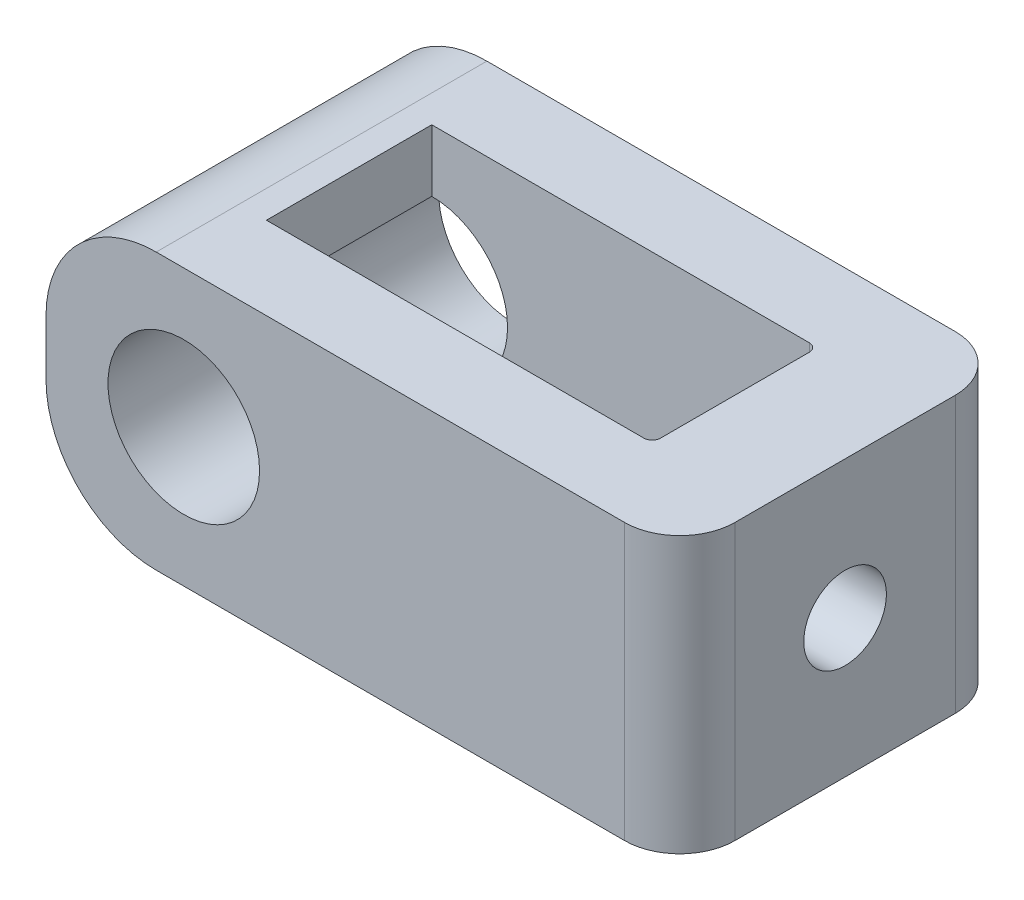
ISO-10303-21;
HEADER;
FILE_DESCRIPTION(('STEP AP214'),'2;1');
FILE_NAME('part.step','',(''),(''),'','','');
FILE_SCHEMA(('AUTOMOTIVE_DESIGN { 1 0 10303 214 1 1 1 1 }'));
ENDSEC;
DATA;
#1=APPLICATION_CONTEXT('core data for automotive mechanical design processes');
#2=APPLICATION_PROTOCOL_DEFINITION('international standard','automotive_design',2000,#1);
#3=PRODUCT_CONTEXT('',#1,'mechanical');
#4=PRODUCT('Part','Part','',(#3));
#5=PRODUCT_RELATED_PRODUCT_CATEGORY('part','',(#4));
#6=PRODUCT_DEFINITION_FORMATION('','',#4);
#7=PRODUCT_DEFINITION_CONTEXT('part definition',#1,'design');
#8=PRODUCT_DEFINITION('design','',#6,#7);
#9=PRODUCT_DEFINITION_SHAPE('','',#8);
#10=(LENGTH_UNIT() NAMED_UNIT(*) SI_UNIT(.MILLI.,.METRE.));
#11=(NAMED_UNIT(*) PLANE_ANGLE_UNIT() SI_UNIT($,.RADIAN.));
#12=(NAMED_UNIT(*) SI_UNIT($,.STERADIAN.) SOLID_ANGLE_UNIT());
#13=UNCERTAINTY_MEASURE_WITH_UNIT(LENGTH_MEASURE(1.E-05),#10,'distance_accuracy_value','');
#14=(GEOMETRIC_REPRESENTATION_CONTEXT(3) GLOBAL_UNCERTAINTY_ASSIGNED_CONTEXT((#13)) GLOBAL_UNIT_ASSIGNED_CONTEXT((#10,
#11,#12)) REPRESENTATION_CONTEXT('',''));
#15=CARTESIAN_POINT('',(0.,0.,0.));
#16=DIRECTION('',(0.,0.,1.));
#17=DIRECTION('',(1.,0.,0.));
#18=AXIS2_PLACEMENT_3D('',#15,#16,#17);
#19=CARTESIAN_POINT('',(0.,10.,-3.));
#20=DIRECTION('',(1.,0.,0.));
#21=DIRECTION('',(0.,0.,-1.));
#22=AXIS2_PLACEMENT_3D('',#19,#20,#21);
#23=PLANE('',#22);
#24=CARTESIAN_POINT('',(0.,5.,0.));
#25=DIRECTION('',(1.,0.,0.));
#26=DIRECTION('',(0.,0.,-1.));
#27=AXIS2_PLACEMENT_3D('',#24,#25,#26);
#28=CIRCLE('',#27,1.5);
#29=CARTESIAN_POINT('',(0.,5.,-1.5));
#30=VERTEX_POINT('',#29);
#31=EDGE_CURVE('E358',#30,#30,#28,.T.);
#32=ORIENTED_EDGE('',*,*,#31,.T.);
#33=EDGE_LOOP('',(#32));
#34=FACE_BOUND('',#33,.T.);
#35=DIRECTION('',(0.,0.,1.));
#36=VECTOR('',#35,1.);
#37=CARTESIAN_POINT('',(0.,0.,-3.));
#38=LINE('',#37,#36);
#39=CARTESIAN_POINT('',(0.,0.,-2.7));
#40=VERTEX_POINT('',#39);
#41=CARTESIAN_POINT('',(0.,0.,2.7));
#42=VERTEX_POINT('',#41);
#43=EDGE_CURVE('E233',#40,#42,#38,.T.);
#44=ORIENTED_EDGE('',*,*,#43,.T.);
#45=DIRECTION('',(0.,-1.,0.));
#46=VECTOR('',#45,1.);
#47=CARTESIAN_POINT('',(0.,10.,2.7));
#48=LINE('',#47,#46);
#49=CARTESIAN_POINT('',(0.,10.,2.7));
#50=VERTEX_POINT('',#49);
#51=EDGE_CURVE('E215',#42,#50,#48,.F.);
#52=ORIENTED_EDGE('',*,*,#51,.T.);
#53=DIRECTION('',(0.,0.,1.));
#54=VECTOR('',#53,1.);
#55=CARTESIAN_POINT('',(0.,10.,-3.));
#56=LINE('',#55,#54);
#57=CARTESIAN_POINT('',(0.,10.,-2.7));
#58=VERTEX_POINT('',#57);
#59=EDGE_CURVE('E240',#58,#50,#56,.T.);
#60=ORIENTED_EDGE('',*,*,#59,.F.);
#61=DIRECTION('',(0.,-1.,0.));
#62=VECTOR('',#61,1.);
#63=CARTESIAN_POINT('',(0.,0.,-2.7));
#64=LINE('',#63,#62);
#65=EDGE_CURVE('E212',#58,#40,#64,.T.);
#66=ORIENTED_EDGE('',*,*,#65,.T.);
#67=EDGE_LOOP('',(#44,#52,#60,#66));
#68=FACE_BOUND('',#67,.T.);
#69=ADVANCED_FACE('F42',(#34,#68),#23,.F.);
#70=CARTESIAN_POINT('',(0.,10.,3.));
#71=DIRECTION('',(0.,0.,1.));
#72=DIRECTION('',(1.,0.,0.));
#73=AXIS2_PLACEMENT_3D('',#70,#71,#72);
#74=PLANE('',#73);
#75=DIRECTION('',(-1.,0.,0.));
#76=VECTOR('',#75,1.);
#77=CARTESIAN_POINT('',(0.,0.,3.));
#78=LINE('',#77,#76);
#79=CARTESIAN_POINT('',(-0.299999999999999,0.,3.));
#80=VERTEX_POINT('',#79);
#81=CARTESIAN_POINT('',(-14.,0.,3.));
#82=VERTEX_POINT('',#81);
#83=EDGE_CURVE('E280',#80,#82,#78,.T.);
#84=ORIENTED_EDGE('',*,*,#83,.T.);
#85=DIRECTION('',(0.,-1.,0.));
#86=VECTOR('',#85,1.);
#87=CARTESIAN_POINT('',(-14.,0.,3.));
#88=LINE('',#87,#86);
#89=CARTESIAN_POINT('',(-14.,2.25,3.));
#90=VERTEX_POINT('',#89);
#91=EDGE_CURVE('E395',#90,#82,#88,.T.);
#92=ORIENTED_EDGE('',*,*,#91,.F.);
#93=CARTESIAN_POINT('',(-14.,5.,3.));
#94=DIRECTION('',(0.,0.,1.));
#95=DIRECTION('',(1.,0.,0.));
#96=AXIS2_PLACEMENT_3D('',#93,#94,#95);
#97=CIRCLE('',#96,2.75);
#98=CARTESIAN_POINT('',(-14.,7.75,3.));
#99=VERTEX_POINT('',#98);
#100=EDGE_CURVE('E281',#90,#99,#97,.T.);
#101=ORIENTED_EDGE('',*,*,#100,.T.);
#102=DIRECTION('',(0.,-1.,0.));
#103=VECTOR('',#102,1.);
#104=CARTESIAN_POINT('',(-14.,0.,3.));
#105=LINE('',#104,#103);
#106=CARTESIAN_POINT('',(-14.,10.,3.));
#107=VERTEX_POINT('',#106);
#108=EDGE_CURVE('E57',#107,#99,#105,.T.);
#109=ORIENTED_EDGE('',*,*,#108,.F.);
#110=DIRECTION('',(-1.,0.,0.));
#111=VECTOR('',#110,1.);
#112=CARTESIAN_POINT('',(0.,10.,3.));
#113=LINE('',#112,#111);
#114=CARTESIAN_POINT('',(-0.299999999999999,10.,3.));
#115=VERTEX_POINT('',#114);
#116=EDGE_CURVE('E244',#115,#107,#113,.T.);
#117=ORIENTED_EDGE('',*,*,#116,.F.);
#118=DIRECTION('',(0.,-1.,0.));
#119=VECTOR('',#118,1.);
#120=CARTESIAN_POINT('',(-0.299999999999999,0.,3.));
#121=LINE('',#120,#119);
#122=EDGE_CURVE('E209',#115,#80,#121,.T.);
#123=ORIENTED_EDGE('',*,*,#122,.T.);
#124=EDGE_LOOP('',(#84,#92,#101,#109,#117,#123));
#125=FACE_BOUND('',#124,.T.);
#126=ADVANCED_FACE('F308',(#125),#74,.F.);
#127=CARTESIAN_POINT('',(0.,10.,6.));
#128=DIRECTION('',(0.,0.,-1.));
#129=DIRECTION('',(-1.,0.,0.));
#130=AXIS2_PLACEMENT_3D('',#127,#128,#129);
#131=PLANE('',#130);
#132=CARTESIAN_POINT('',(-14.,5.,6.));
#133=DIRECTION('',(0.,0.,1.));
#134=DIRECTION('',(1.,0.,0.));
#135=AXIS2_PLACEMENT_3D('',#132,#133,#134);
#136=CIRCLE('',#135,2.75);
#137=CARTESIAN_POINT('',(-11.25,5.,6.));
#138=VERTEX_POINT('',#137);
#139=EDGE_CURVE('E253',#138,#138,#136,.T.);
#140=ORIENTED_EDGE('',*,*,#139,.F.);
#141=EDGE_LOOP('',(#140));
#142=FACE_BOUND('',#141,.T.);
#143=DIRECTION('',(1.,0.,0.));
#144=VECTOR('',#143,1.);
#145=CARTESIAN_POINT('',(0.,0.,6.));
#146=LINE('',#145,#144);
#147=CARTESIAN_POINT('',(-15.,0.,6.));
#148=VERTEX_POINT('',#147);
#149=CARTESIAN_POINT('',(2.,0.,6.));
#150=VERTEX_POINT('',#149);
#151=EDGE_CURVE('E283',#148,#150,#146,.T.);
#152=ORIENTED_EDGE('',*,*,#151,.T.);
#153=DIRECTION('',(0.,-1.,0.));
#154=VECTOR('',#153,1.);
#155=CARTESIAN_POINT('',(2.,10.,6.));
#156=LINE('',#155,#154);
#157=CARTESIAN_POINT('',(2.,10.,6.));
#158=VERTEX_POINT('',#157);
#159=EDGE_CURVE('E207',#150,#158,#156,.F.);
#160=ORIENTED_EDGE('',*,*,#159,.T.);
#161=DIRECTION('',(1.,0.,0.));
#162=VECTOR('',#161,1.);
#163=CARTESIAN_POINT('',(-19.,10.,6.));
#164=LINE('',#163,#162);
#165=CARTESIAN_POINT('',(-15.,10.,6.));
#166=VERTEX_POINT('',#165);
#167=EDGE_CURVE('E264',#166,#158,#164,.T.);
#168=ORIENTED_EDGE('',*,*,#167,.F.);
#169=CARTESIAN_POINT('',(-15.,6.,6.));
#170=DIRECTION('',(0.,0.,-1.));
#171=DIRECTION('',(-1.,0.,0.));
#172=AXIS2_PLACEMENT_3D('',#169,#170,#171);
#173=CIRCLE('',#172,4.);
#174=CARTESIAN_POINT('',(-19.,6.,6.));
#175=VERTEX_POINT('',#174);
#176=EDGE_CURVE('E187',#166,#175,#173,.F.);
#177=ORIENTED_EDGE('',*,*,#176,.T.);
#178=DIRECTION('',(0.,-1.,0.));
#179=VECTOR('',#178,1.);
#180=CARTESIAN_POINT('',(-19.,10.,6.));
#181=LINE('',#180,#179);
#182=CARTESIAN_POINT('',(-19.,4.,6.));
#183=VERTEX_POINT('',#182);
#184=EDGE_CURVE('E161',#175,#183,#181,.T.);
#185=ORIENTED_EDGE('',*,*,#184,.T.);
#186=CARTESIAN_POINT('',(-15.,4.,6.));
#187=DIRECTION('',(0.,0.,-1.));
#188=DIRECTION('',(-1.,0.,0.));
#189=AXIS2_PLACEMENT_3D('',#186,#187,#188);
#190=CIRCLE('',#189,4.);
#191=EDGE_CURVE('E189',#183,#148,#190,.F.);
#192=ORIENTED_EDGE('',*,*,#191,.T.);
#193=EDGE_LOOP('',(#152,#160,#168,#177,#185,#192));
#194=FACE_BOUND('',#193,.T.);
#195=ADVANCED_FACE('F261',(#142,#194),#131,.F.);
#196=CARTESIAN_POINT('',(4.,10.,-6.));
#197=DIRECTION('',(-1.,0.,0.));
#198=DIRECTION('',(0.,0.,1.));
#199=AXIS2_PLACEMENT_3D('',#196,#197,#198);
#200=PLANE('',#199);
#201=CARTESIAN_POINT('',(4.,5.,0.));
#202=DIRECTION('',(1.,0.,0.));
#203=DIRECTION('',(0.,0.,-1.));
#204=AXIS2_PLACEMENT_3D('',#201,#202,#203);
#205=CIRCLE('',#204,1.5);
#206=CARTESIAN_POINT('',(4.,5.,-1.5));
#207=VERTEX_POINT('',#206);
#208=EDGE_CURVE('E360',#207,#207,#205,.T.);
#209=ORIENTED_EDGE('',*,*,#208,.F.);
#210=EDGE_LOOP('',(#209));
#211=FACE_BOUND('',#210,.T.);
#212=DIRECTION('',(0.,0.,-1.));
#213=VECTOR('',#212,1.);
#214=CARTESIAN_POINT('',(4.,0.,-6.));
#215=LINE('',#214,#213);
#216=CARTESIAN_POINT('',(4.,0.,4.));
#217=VERTEX_POINT('',#216);
#218=CARTESIAN_POINT('',(4.,0.,-4.));
#219=VERTEX_POINT('',#218);
#220=EDGE_CURVE('E246',#217,#219,#215,.T.);
#221=ORIENTED_EDGE('',*,*,#220,.T.);
#222=DIRECTION('',(0.,-1.,0.));
#223=VECTOR('',#222,1.);
#224=CARTESIAN_POINT('',(4.,10.,-4.));
#225=LINE('',#224,#223);
#226=CARTESIAN_POINT('',(4.,10.,-4.));
#227=VERTEX_POINT('',#226);
#228=EDGE_CURVE('E201',#219,#227,#225,.F.);
#229=ORIENTED_EDGE('',*,*,#228,.T.);
#230=DIRECTION('',(0.,0.,-1.));
#231=VECTOR('',#230,1.);
#232=CARTESIAN_POINT('',(4.,10.,-6.));
#233=LINE('',#232,#231);
#234=CARTESIAN_POINT('',(4.,10.,4.));
#235=VERTEX_POINT('',#234);
#236=EDGE_CURVE('E273',#235,#227,#233,.T.);
#237=ORIENTED_EDGE('',*,*,#236,.F.);
#238=DIRECTION('',(0.,-1.,0.));
#239=VECTOR('',#238,1.);
#240=CARTESIAN_POINT('',(4.,10.,4.));
#241=LINE('',#240,#239);
#242=EDGE_CURVE('E198',#235,#217,#241,.T.);
#243=ORIENTED_EDGE('',*,*,#242,.T.);
#244=EDGE_LOOP('',(#221,#229,#237,#243));
#245=FACE_BOUND('',#244,.T.);
#246=ADVANCED_FACE('F288',(#211,#245),#200,.F.);
#247=CARTESIAN_POINT('',(-19.,10.,-6.));
#248=DIRECTION('',(0.,0.,1.));
#249=DIRECTION('',(1.,0.,0.));
#250=AXIS2_PLACEMENT_3D('',#247,#248,#249);
#251=PLANE('',#250);
#252=CARTESIAN_POINT('',(-14.,5.,-6.));
#253=DIRECTION('',(0.,0.,1.));
#254=DIRECTION('',(1.,0.,0.));
#255=AXIS2_PLACEMENT_3D('',#252,#253,#254);
#256=CIRCLE('',#255,2.75);
#257=CARTESIAN_POINT('',(-11.25,5.,-6.));
#258=VERTEX_POINT('',#257);
#259=EDGE_CURVE('E252',#258,#258,#256,.T.);
#260=ORIENTED_EDGE('',*,*,#259,.T.);
#261=EDGE_LOOP('',(#260));
#262=FACE_BOUND('',#261,.T.);
#263=DIRECTION('',(-1.,0.,0.));
#264=VECTOR('',#263,1.);
#265=CARTESIAN_POINT('',(0.,10.,-6.));
#266=LINE('',#265,#264);
#267=CARTESIAN_POINT('',(2.,10.,-6.));
#268=VERTEX_POINT('',#267);
#269=CARTESIAN_POINT('',(-15.,10.,-6.));
#270=VERTEX_POINT('',#269);
#271=EDGE_CURVE('E269',#268,#270,#266,.T.);
#272=ORIENTED_EDGE('',*,*,#271,.F.);
#273=DIRECTION('',(0.,-1.,0.));
#274=VECTOR('',#273,1.);
#275=CARTESIAN_POINT('',(2.,10.,-6.));
#276=LINE('',#275,#274);
#277=CARTESIAN_POINT('',(2.,0.,-6.));
#278=VERTEX_POINT('',#277);
#279=EDGE_CURVE('E191',#268,#278,#276,.T.);
#280=ORIENTED_EDGE('',*,*,#279,.T.);
#281=DIRECTION('',(-1.,0.,0.));
#282=VECTOR('',#281,1.);
#283=CARTESIAN_POINT('',(-19.,0.,-6.));
#284=LINE('',#283,#282);
#285=CARTESIAN_POINT('',(-15.,0.,-6.));
#286=VERTEX_POINT('',#285);
#287=EDGE_CURVE('E241',#278,#286,#284,.T.);
#288=ORIENTED_EDGE('',*,*,#287,.T.);
#289=CARTESIAN_POINT('',(-15.,4.,-6.));
#290=DIRECTION('',(0.,0.,1.));
#291=DIRECTION('',(1.,0.,0.));
#292=AXIS2_PLACEMENT_3D('',#289,#290,#291);
#293=CIRCLE('',#292,4.);
#294=CARTESIAN_POINT('',(-19.,4.,-6.));
#295=VERTEX_POINT('',#294);
#296=EDGE_CURVE('E174',#286,#295,#293,.F.);
#297=ORIENTED_EDGE('',*,*,#296,.T.);
#298=DIRECTION('',(0.,-1.,0.));
#299=VECTOR('',#298,1.);
#300=CARTESIAN_POINT('',(-19.,10.,-6.));
#301=LINE('',#300,#299);
#302=CARTESIAN_POINT('',(-19.,6.,-6.));
#303=VERTEX_POINT('',#302);
#304=EDGE_CURVE('E158',#303,#295,#301,.T.);
#305=ORIENTED_EDGE('',*,*,#304,.F.);
#306=CARTESIAN_POINT('',(-15.,6.,-6.));
#307=DIRECTION('',(0.,0.,1.));
#308=DIRECTION('',(1.,0.,0.));
#309=AXIS2_PLACEMENT_3D('',#306,#307,#308);
#310=CIRCLE('',#309,4.);
#311=EDGE_CURVE('E171',#303,#270,#310,.F.);
#312=ORIENTED_EDGE('',*,*,#311,.T.);
#313=EDGE_LOOP('',(#272,#280,#288,#297,#305,#312));
#314=FACE_BOUND('',#313,.T.);
#315=ADVANCED_FACE('F170',(#262,#314),#251,.F.);
#316=CARTESIAN_POINT('',(-19.,10.,-3.));
#317=DIRECTION('',(1.,0.,0.));
#318=DIRECTION('',(0.,0.,-1.));
#319=AXIS2_PLACEMENT_3D('',#316,#317,#318);
#320=PLANE('',#319);
#321=ORIENTED_EDGE('',*,*,#304,.T.);
#322=DIRECTION('',(0.,0.,1.));
#323=VECTOR('',#322,1.);
#324=CARTESIAN_POINT('',(-19.,4.,-3.));
#325=LINE('',#324,#323);
#326=EDGE_CURVE('E165',#295,#183,#325,.T.);
#327=ORIENTED_EDGE('',*,*,#326,.T.);
#328=ORIENTED_EDGE('',*,*,#184,.F.);
#329=DIRECTION('',(0.,0.,1.));
#330=VECTOR('',#329,1.);
#331=CARTESIAN_POINT('',(-19.,6.,-3.));
#332=LINE('',#331,#330);
#333=EDGE_CURVE('E155',#175,#303,#332,.F.);
#334=ORIENTED_EDGE('',*,*,#333,.T.);
#335=EDGE_LOOP('',(#321,#327,#328,#334));
#336=FACE_BOUND('',#335,.T.);
#337=ADVANCED_FACE('F157',(#336),#320,.F.);
#338=CARTESIAN_POINT('',(0.,10.,-3.));
#339=DIRECTION('',(0.,0.,-1.));
#340=DIRECTION('',(-1.,0.,0.));
#341=AXIS2_PLACEMENT_3D('',#338,#339,#340);
#342=PLANE('',#341);
#343=CARTESIAN_POINT('',(-14.,5.,-3.));
#344=DIRECTION('',(0.,0.,-1.));
#345=DIRECTION('',(-1.,0.,0.));
#346=AXIS2_PLACEMENT_3D('',#343,#344,#345);
#347=CIRCLE('',#346,2.75);
#348=CARTESIAN_POINT('',(-14.,7.75,-3.));
#349=VERTEX_POINT('',#348);
#350=CARTESIAN_POINT('',(-14.,2.25,-3.));
#351=VERTEX_POINT('',#350);
#352=EDGE_CURVE('E251',#349,#351,#347,.T.);
#353=ORIENTED_EDGE('',*,*,#352,.T.);
#354=DIRECTION('',(0.,-1.,0.));
#355=VECTOR('',#354,1.);
#356=CARTESIAN_POINT('',(-14.,0.,-3.));
#357=LINE('',#356,#355);
#358=CARTESIAN_POINT('',(-14.,0.,-3.));
#359=VERTEX_POINT('',#358);
#360=EDGE_CURVE('E239',#351,#359,#357,.T.);
#361=ORIENTED_EDGE('',*,*,#360,.T.);
#362=DIRECTION('',(1.,0.,0.));
#363=VECTOR('',#362,1.);
#364=CARTESIAN_POINT('',(0.,0.,-3.));
#365=LINE('',#364,#363);
#366=CARTESIAN_POINT('',(-0.299999999999999,0.,-3.));
#367=VERTEX_POINT('',#366);
#368=EDGE_CURVE('E230',#359,#367,#365,.T.);
#369=ORIENTED_EDGE('',*,*,#368,.T.);
#370=DIRECTION('',(0.,-1.,0.));
#371=VECTOR('',#370,1.);
#372=CARTESIAN_POINT('',(-0.299999999999999,10.,-3.));
#373=LINE('',#372,#371);
#374=CARTESIAN_POINT('',(-0.299999999999999,10.,-3.));
#375=VERTEX_POINT('',#374);
#376=EDGE_CURVE('E217',#367,#375,#373,.F.);
#377=ORIENTED_EDGE('',*,*,#376,.T.);
#378=DIRECTION('',(1.,0.,0.));
#379=VECTOR('',#378,1.);
#380=CARTESIAN_POINT('',(0.,10.,-3.));
#381=LINE('',#380,#379);
#382=CARTESIAN_POINT('',(-14.,10.,-3.));
#383=VERTEX_POINT('',#382);
#384=EDGE_CURVE('E65',#383,#375,#381,.T.);
#385=ORIENTED_EDGE('',*,*,#384,.F.);
#386=DIRECTION('',(0.,-1.,0.));
#387=VECTOR('',#386,1.);
#388=CARTESIAN_POINT('',(-14.,0.,-3.));
#389=LINE('',#388,#387);
#390=EDGE_CURVE('E375',#383,#349,#389,.T.);
#391=ORIENTED_EDGE('',*,*,#390,.T.);
#392=EDGE_LOOP('',(#353,#361,#369,#377,#385,#391));
#393=FACE_BOUND('',#392,.T.);
#394=ADVANCED_FACE('F237',(#393),#342,.F.);
#395=CARTESIAN_POINT('',(0.,10.,0.));
#396=DIRECTION('',(0.,-1.,0.));
#397=DIRECTION('',(0.,0.,-1.));
#398=AXIS2_PLACEMENT_3D('',#395,#396,#397);
#399=PLANE('',#398);
#400=ORIENTED_EDGE('',*,*,#271,.T.);
#401=DIRECTION('',(0.,0.,1.));
#402=VECTOR('',#401,1.);
#403=CARTESIAN_POINT('',(-15.,10.,0.));
#404=LINE('',#403,#402);
#405=EDGE_CURVE('E178',#270,#166,#404,.T.);
#406=ORIENTED_EDGE('',*,*,#405,.T.);
#407=ORIENTED_EDGE('',*,*,#167,.T.);
#408=CARTESIAN_POINT('',(2.,10.,4.));
#409=DIRECTION('',(0.,-1.,0.));
#410=DIRECTION('',(0.,0.,-1.));
#411=AXIS2_PLACEMENT_3D('',#408,#409,#410);
#412=CIRCLE('',#411,2.);
#413=EDGE_CURVE('E203',#158,#235,#412,.F.);
#414=ORIENTED_EDGE('',*,*,#413,.T.);
#415=ORIENTED_EDGE('',*,*,#236,.T.);
#416=CARTESIAN_POINT('',(2.,10.,-4.));
#417=DIRECTION('',(0.,-1.,0.));
#418=DIRECTION('',(0.,0.,-1.));
#419=AXIS2_PLACEMENT_3D('',#416,#417,#418);
#420=CIRCLE('',#419,2.);
#421=EDGE_CURVE('E205',#227,#268,#420,.F.);
#422=ORIENTED_EDGE('',*,*,#421,.T.);
#423=EDGE_LOOP('',(#400,#406,#407,#414,#415,#422));
#424=FACE_BOUND('',#423,.T.);
#425=ORIENTED_EDGE('',*,*,#116,.T.);
#426=DIRECTION('',(0.,0.,-1.));
#427=VECTOR('',#426,1.);
#428=CARTESIAN_POINT('',(-14.,10.,3.));
#429=LINE('',#428,#427);
#430=EDGE_CURVE('E368',#107,#383,#429,.T.);
#431=ORIENTED_EDGE('',*,*,#430,.T.);
#432=ORIENTED_EDGE('',*,*,#384,.T.);
#433=CARTESIAN_POINT('',(-0.299999999999999,10.,-2.7));
#434=DIRECTION('',(0.,-1.,0.));
#435=DIRECTION('',(0.,0.,-1.));
#436=AXIS2_PLACEMENT_3D('',#433,#434,#435);
#437=CIRCLE('',#436,0.3);
#438=EDGE_CURVE('E11',#375,#58,#437,.T.);
#439=ORIENTED_EDGE('',*,*,#438,.T.);
#440=ORIENTED_EDGE('',*,*,#59,.T.);
#441=CARTESIAN_POINT('',(-0.299999999999999,10.,2.7));
#442=DIRECTION('',(0.,-1.,0.));
#443=DIRECTION('',(0.,0.,-1.));
#444=AXIS2_PLACEMENT_3D('',#441,#442,#443);
#445=CIRCLE('',#444,0.3);
#446=EDGE_CURVE('E221',#50,#115,#445,.T.);
#447=ORIENTED_EDGE('',*,*,#446,.T.);
#448=EDGE_LOOP('',(#425,#431,#432,#439,#440,#447));
#449=FACE_BOUND('',#448,.T.);
#450=ADVANCED_FACE('F266',(#424,#449),#399,.F.);
#451=CARTESIAN_POINT('',(0.,0.,0.));
#452=DIRECTION('',(0.,-1.,0.));
#453=DIRECTION('',(0.,0.,-1.));
#454=AXIS2_PLACEMENT_3D('',#451,#452,#453);
#455=PLANE('',#454);
#456=DIRECTION('',(0.,0.,-1.));
#457=VECTOR('',#456,1.);
#458=CARTESIAN_POINT('',(-14.,0.,3.));
#459=LINE('',#458,#457);
#460=EDGE_CURVE('E377',#82,#359,#459,.T.);
#461=ORIENTED_EDGE('',*,*,#460,.F.);
#462=ORIENTED_EDGE('',*,*,#83,.F.);
#463=CARTESIAN_POINT('',(-0.299999999999999,0.,2.7));
#464=DIRECTION('',(0.,-1.,0.));
#465=DIRECTION('',(0.,0.,-1.));
#466=AXIS2_PLACEMENT_3D('',#463,#464,#465);
#467=CIRCLE('',#466,0.3);
#468=EDGE_CURVE('E219',#80,#42,#467,.F.);
#469=ORIENTED_EDGE('',*,*,#468,.T.);
#470=ORIENTED_EDGE('',*,*,#43,.F.);
#471=CARTESIAN_POINT('',(-0.299999999999999,0.,-2.7));
#472=DIRECTION('',(0.,-1.,0.));
#473=DIRECTION('',(0.,0.,-1.));
#474=AXIS2_PLACEMENT_3D('',#471,#472,#473);
#475=CIRCLE('',#474,0.3);
#476=EDGE_CURVE('E50',#40,#367,#475,.F.);
#477=ORIENTED_EDGE('',*,*,#476,.T.);
#478=ORIENTED_EDGE('',*,*,#368,.F.);
#479=EDGE_LOOP('',(#461,#462,#469,#470,#477,#478));
#480=FACE_BOUND('',#479,.T.);
#481=ORIENTED_EDGE('',*,*,#287,.F.);
#482=CARTESIAN_POINT('',(2.,0.,-4.));
#483=DIRECTION('',(0.,-1.,0.));
#484=DIRECTION('',(0.,0.,-1.));
#485=AXIS2_PLACEMENT_3D('',#482,#483,#484);
#486=CIRCLE('',#485,2.);
#487=EDGE_CURVE('E196',#278,#219,#486,.T.);
#488=ORIENTED_EDGE('',*,*,#487,.T.);
#489=ORIENTED_EDGE('',*,*,#220,.F.);
#490=CARTESIAN_POINT('',(2.,0.,4.));
#491=DIRECTION('',(0.,-1.,0.));
#492=DIRECTION('',(0.,0.,-1.));
#493=AXIS2_PLACEMENT_3D('',#490,#491,#492);
#494=CIRCLE('',#493,2.);
#495=EDGE_CURVE('E194',#217,#150,#494,.T.);
#496=ORIENTED_EDGE('',*,*,#495,.T.);
#497=ORIENTED_EDGE('',*,*,#151,.F.);
#498=DIRECTION('',(0.,0.,1.));
#499=VECTOR('',#498,1.);
#500=CARTESIAN_POINT('',(-15.,0.,3.));
#501=LINE('',#500,#499);
#502=EDGE_CURVE('E180',#148,#286,#501,.F.);
#503=ORIENTED_EDGE('',*,*,#502,.T.);
#504=EDGE_LOOP('',(#481,#488,#489,#496,#497,#503));
#505=FACE_BOUND('',#504,.T.);
#506=ADVANCED_FACE('F228',(#480,#505),#455,.T.);
#507=CARTESIAN_POINT('',(-14.,5.,-10.));
#508=DIRECTION('',(0.,0.,1.));
#509=DIRECTION('',(1.,0.,0.));
#510=AXIS2_PLACEMENT_3D('',#507,#508,#509);
#511=CYLINDRICAL_SURFACE('',#510,2.75);
#512=ORIENTED_EDGE('',*,*,#139,.T.);
#513=EDGE_LOOP('',(#512));
#514=FACE_BOUND('',#513,.T.);
#515=ORIENTED_EDGE('',*,*,#100,.F.);
#516=DIRECTION('',(0.,0.,-1.));
#517=VECTOR('',#516,1.);
#518=CARTESIAN_POINT('',(-14.,2.25,3.));
#519=LINE('',#518,#517);
#520=EDGE_CURVE('E379',#90,#351,#519,.T.);
#521=ORIENTED_EDGE('',*,*,#520,.T.);
#522=ORIENTED_EDGE('',*,*,#352,.F.);
#523=DIRECTION('',(0.,0.,-1.));
#524=VECTOR('',#523,1.);
#525=CARTESIAN_POINT('',(-14.,7.75,3.));
#526=LINE('',#525,#524);
#527=EDGE_CURVE('E376',#99,#349,#526,.T.);
#528=ORIENTED_EDGE('',*,*,#527,.F.);
#529=EDGE_LOOP('',(#515,#521,#522,#528));
#530=FACE_BOUND('',#529,.T.);
#531=ORIENTED_EDGE('',*,*,#259,.F.);
#532=EDGE_LOOP('',(#531));
#533=FACE_BOUND('',#532,.T.);
#534=ADVANCED_FACE('F321',(#514,#530,#533),#511,.F.);
#535=CARTESIAN_POINT('',(-15.,4.,-3.));
#536=DIRECTION('',(0.,0.,-1.));
#537=DIRECTION('',(-1.,0.,0.));
#538=AXIS2_PLACEMENT_3D('',#535,#536,#537);
#539=CYLINDRICAL_SURFACE('',#538,4.);
#540=ORIENTED_EDGE('',*,*,#296,.F.);
#541=ORIENTED_EDGE('',*,*,#502,.F.);
#542=ORIENTED_EDGE('',*,*,#191,.F.);
#543=ORIENTED_EDGE('',*,*,#326,.F.);
#544=EDGE_LOOP('',(#540,#541,#542,#543));
#545=FACE_BOUND('',#544,.T.);
#546=ADVANCED_FACE('F257',(#545),#539,.T.);
#547=CARTESIAN_POINT('',(-15.,6.,0.));
#548=DIRECTION('',(0.,0.,1.));
#549=DIRECTION('',(1.,0.,0.));
#550=AXIS2_PLACEMENT_3D('',#547,#548,#549);
#551=CYLINDRICAL_SURFACE('',#550,4.);
#552=ORIENTED_EDGE('',*,*,#311,.F.);
#553=ORIENTED_EDGE('',*,*,#333,.F.);
#554=ORIENTED_EDGE('',*,*,#176,.F.);
#555=ORIENTED_EDGE('',*,*,#405,.F.);
#556=EDGE_LOOP('',(#552,#553,#554,#555));
#557=FACE_BOUND('',#556,.T.);
#558=ADVANCED_FACE('F176',(#557),#551,.T.);
#559=CARTESIAN_POINT('',(-6.,5.,0.));
#560=DIRECTION('',(1.,0.,0.));
#561=DIRECTION('',(0.,0.,-1.));
#562=AXIS2_PLACEMENT_3D('',#559,#560,#561);
#563=CYLINDRICAL_SURFACE('',#562,1.5);
#564=ORIENTED_EDGE('',*,*,#208,.T.);
#565=EDGE_LOOP('',(#564));
#566=FACE_BOUND('',#565,.T.);
#567=ORIENTED_EDGE('',*,*,#31,.F.);
#568=EDGE_LOOP('',(#567));
#569=FACE_BOUND('',#568,.T.);
#570=ADVANCED_FACE('F305',(#566,#569),#563,.F.);
#571=CARTESIAN_POINT('',(2.,10.,-4.));
#572=DIRECTION('',(0.,-1.,0.));
#573=DIRECTION('',(0.,0.,-1.));
#574=AXIS2_PLACEMENT_3D('',#571,#572,#573);
#575=CYLINDRICAL_SURFACE('',#574,2.);
#576=ORIENTED_EDGE('',*,*,#421,.F.);
#577=ORIENTED_EDGE('',*,*,#228,.F.);
#578=ORIENTED_EDGE('',*,*,#487,.F.);
#579=ORIENTED_EDGE('',*,*,#279,.F.);
#580=EDGE_LOOP('',(#576,#577,#578,#579));
#581=FACE_BOUND('',#580,.T.);
#582=ADVANCED_FACE('F292',(#581),#575,.T.);
#583=CARTESIAN_POINT('',(2.,10.,4.));
#584=DIRECTION('',(0.,-1.,0.));
#585=DIRECTION('',(0.,0.,-1.));
#586=AXIS2_PLACEMENT_3D('',#583,#584,#585);
#587=CYLINDRICAL_SURFACE('',#586,2.);
#588=ORIENTED_EDGE('',*,*,#413,.F.);
#589=ORIENTED_EDGE('',*,*,#159,.F.);
#590=ORIENTED_EDGE('',*,*,#495,.F.);
#591=ORIENTED_EDGE('',*,*,#242,.F.);
#592=EDGE_LOOP('',(#588,#589,#590,#591));
#593=FACE_BOUND('',#592,.T.);
#594=ADVANCED_FACE('F296',(#593),#587,.T.);
#595=CARTESIAN_POINT('',(-0.299999999999999,10.,2.7));
#596=DIRECTION('',(0.,1.,0.));
#597=DIRECTION('',(0.,0.,1.));
#598=AXIS2_PLACEMENT_3D('',#595,#596,#597);
#599=CYLINDRICAL_SURFACE('',#598,0.3);
#600=ORIENTED_EDGE('',*,*,#446,.F.);
#601=ORIENTED_EDGE('',*,*,#51,.F.);
#602=ORIENTED_EDGE('',*,*,#468,.F.);
#603=ORIENTED_EDGE('',*,*,#122,.F.);
#604=EDGE_LOOP('',(#600,#601,#602,#603));
#605=FACE_BOUND('',#604,.T.);
#606=ADVANCED_FACE('F298',(#605),#599,.F.);
#607=CARTESIAN_POINT('',(-0.299999999999999,10.,-2.7));
#608=DIRECTION('',(0.,1.,0.));
#609=DIRECTION('',(0.,0.,1.));
#610=AXIS2_PLACEMENT_3D('',#607,#608,#609);
#611=CYLINDRICAL_SURFACE('',#610,0.3);
#612=ORIENTED_EDGE('',*,*,#438,.F.);
#613=ORIENTED_EDGE('',*,*,#376,.F.);
#614=ORIENTED_EDGE('',*,*,#476,.F.);
#615=ORIENTED_EDGE('',*,*,#65,.F.);
#616=EDGE_LOOP('',(#612,#613,#614,#615));
#617=FACE_BOUND('',#616,.T.);
#618=ADVANCED_FACE('F44',(#617),#611,.F.);
#619=CARTESIAN_POINT('',(-14.,0.,3.));
#620=DIRECTION('',(1.,0.,0.));
#621=DIRECTION('',(0.,0.,-1.));
#622=AXIS2_PLACEMENT_3D('',#619,#620,#621);
#623=PLANE('',#622);
#624=ORIENTED_EDGE('',*,*,#360,.F.);
#625=ORIENTED_EDGE('',*,*,#520,.F.);
#626=ORIENTED_EDGE('',*,*,#91,.T.);
#627=ORIENTED_EDGE('',*,*,#460,.T.);
#628=EDGE_LOOP('',(#624,#625,#626,#627));
#629=FACE_BOUND('',#628,.T.);
#630=ADVANCED_FACE('F334',(#629),#623,.T.);
#631=CARTESIAN_POINT('',(-14.,0.,3.));
#632=DIRECTION('',(1.,0.,0.));
#633=DIRECTION('',(0.,0.,-1.));
#634=AXIS2_PLACEMENT_3D('',#631,#632,#633);
#635=PLANE('',#634);
#636=ORIENTED_EDGE('',*,*,#390,.F.);
#637=ORIENTED_EDGE('',*,*,#430,.F.);
#638=ORIENTED_EDGE('',*,*,#108,.T.);
#639=ORIENTED_EDGE('',*,*,#527,.T.);
#640=EDGE_LOOP('',(#636,#637,#638,#639));
#641=FACE_BOUND('',#640,.T.);
#642=ADVANCED_FACE('F373',(#641),#635,.T.);
#643=CLOSED_SHELL('',(#69,#126,#195,#246,#315,#337,#394,#450,#506,#534,#546,#558,#570,#582,#594,
#606,#618,#630,#642));
#644=MANIFOLD_SOLID_BREP('B2',#643);
#645=ADVANCED_BREP_SHAPE_REPRESENTATION('',(#18,#644),#14);
#646=SHAPE_DEFINITION_REPRESENTATION(#9,#645);
ENDSEC;
END-ISO-10303-21;
